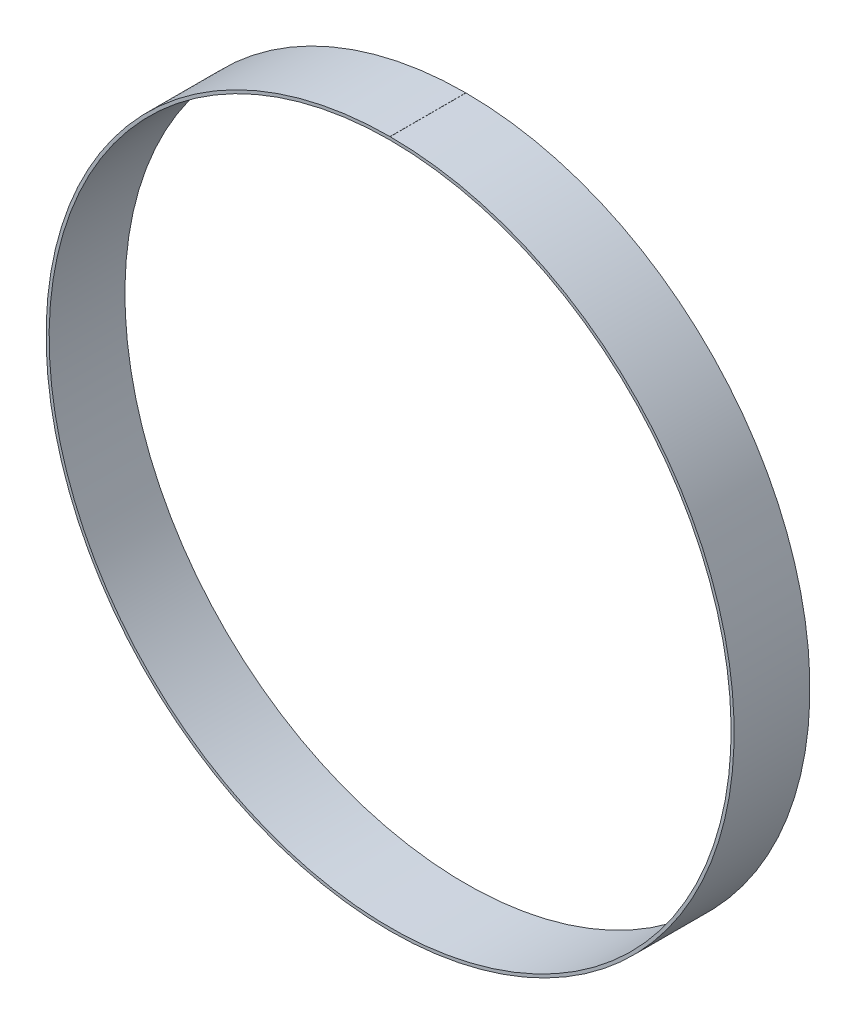
ISO-10303-21;
HEADER;
FILE_DESCRIPTION(('STEP AP214'),'2;1');
FILE_NAME('part.step','',(''),(''),'','','');
FILE_SCHEMA(('AUTOMOTIVE_DESIGN { 1 0 10303 214 1 1 1 1 }'));
ENDSEC;
DATA;
#1=APPLICATION_CONTEXT('core data for automotive mechanical design processes');
#2=APPLICATION_PROTOCOL_DEFINITION('international standard','automotive_design',2000,#1);
#3=PRODUCT_CONTEXT('',#1,'mechanical');
#4=PRODUCT('Part','Part','',(#3));
#5=PRODUCT_RELATED_PRODUCT_CATEGORY('part','',(#4));
#6=PRODUCT_DEFINITION_FORMATION('','',#4);
#7=PRODUCT_DEFINITION_CONTEXT('part definition',#1,'design');
#8=PRODUCT_DEFINITION('design','',#6,#7);
#9=PRODUCT_DEFINITION_SHAPE('','',#8);
#10=(LENGTH_UNIT() NAMED_UNIT(*) SI_UNIT(.MILLI.,.METRE.));
#11=(NAMED_UNIT(*) PLANE_ANGLE_UNIT() SI_UNIT($,.RADIAN.));
#12=(NAMED_UNIT(*) SI_UNIT($,.STERADIAN.) SOLID_ANGLE_UNIT());
#13=UNCERTAINTY_MEASURE_WITH_UNIT(LENGTH_MEASURE(1.E-05),#10,'distance_accuracy_value','');
#14=(GEOMETRIC_REPRESENTATION_CONTEXT(3) GLOBAL_UNCERTAINTY_ASSIGNED_CONTEXT((#13)) GLOBAL_UNIT_ASSIGNED_CONTEXT((#10,
#11,#12)) REPRESENTATION_CONTEXT('',''));
#15=CARTESIAN_POINT('',(0.,0.,0.));
#16=DIRECTION('',(0.,0.,1.));
#17=DIRECTION('',(1.,0.,0.));
#18=AXIS2_PLACEMENT_3D('',#15,#16,#17);
#19=CARTESIAN_POINT('',(-0.0499999999893381,227.,1.55431223447522E-12));
#20=DIRECTION('',(0.999999975741816,0.000220264311790574,0.));
#21=DIRECTION('',(0.,0.,-1.));
#22=AXIS2_PLACEMENT_3D('',#19,#20,#21);
#23=PLANE('',#22);
#24=DIRECTION('',(-0.000220264311790574,0.999999975741816,0.));
#25=VECTOR('',#24,1.);
#26=CARTESIAN_POINT('',(-0.0499999999893936,227.,24.9999999999999));
#27=LINE('',#26,#25);
#28=CARTESIAN_POINT('',(-0.0495594713658349,225.000000048516,24.9999999999999));
#29=VERTEX_POINT('',#28);
#30=CARTESIAN_POINT('',(-0.0499999999893936,227.,24.9999999999999));
#31=VERTEX_POINT('',#30);
#32=EDGE_CURVE('E12',#29,#31,#27,.T.);
#33=ORIENTED_EDGE('',*,*,#32,.F.);
#34=DIRECTION('',(0.,0.,1.));
#35=VECTOR('',#34,1.);
#36=CARTESIAN_POINT('',(-0.0495594713626246,225.000000048516,-1420.78267888831));
#37=LINE('',#36,#35);
#38=CARTESIAN_POINT('',(-0.0495594713657239,225.000000048516,-24.9999999999968));
#39=VERTEX_POINT('',#38);
#40=EDGE_CURVE('E81',#29,#39,#37,.F.);
#41=ORIENTED_EDGE('',*,*,#40,.T.);
#42=DIRECTION('',(-0.000220264311790574,0.999999975741816,0.));
#43=VECTOR('',#42,1.);
#44=CARTESIAN_POINT('',(-0.0499999999892826,227.,-24.9999999999968));
#45=LINE('',#44,#43);
#46=CARTESIAN_POINT('',(-0.0499999999892826,227.,-24.9999999999968));
#47=VERTEX_POINT('',#46);
#48=EDGE_CURVE('E55',#39,#47,#45,.T.);
#49=ORIENTED_EDGE('',*,*,#48,.T.);
#50=DIRECTION('',(0.,0.,-1.));
#51=VECTOR('',#50,1.);
#52=CARTESIAN_POINT('',(-0.0499999999893936,227.,24.9999999999999));
#53=LINE('',#52,#51);
#54=EDGE_CURVE('E84',#31,#47,#53,.T.);
#55=ORIENTED_EDGE('',*,*,#54,.F.);
#56=EDGE_LOOP('',(#33,#41,#49,#55));
#57=FACE_BOUND('',#56,.T.);
#58=ADVANCED_FACE('F45',(#57),#23,.T.);
#59=CARTESIAN_POINT('',(-1.21282239080259E-09,5.50660761433619E-06,-24.9999999999968));
#60=DIRECTION('',(0.,0.,-1.));
#61=DIRECTION('',(-1.,0.,0.));
#62=AXIS2_PLACEMENT_3D('',#59,#60,#61);
#63=PLANE('',#62);
#64=ORIENTED_EDGE('',*,*,#48,.F.);
#65=CARTESIAN_POINT('',(-1.21282239126486E-09,5.50660761433619E-06,-24.9999999999968));
#66=DIRECTION('',(0.,0.,1.));
#67=DIRECTION('',(1.,0.,0.));
#68=AXIS2_PLACEMENT_3D('',#65,#66,#67);
#69=CIRCLE('',#68,225.);
#70=CARTESIAN_POINT('',(0.0495594689548948,225.000000048516,-24.9999999999968));
#71=VERTEX_POINT('',#70);
#72=EDGE_CURVE('E96',#39,#71,#69,.T.);
#73=ORIENTED_EDGE('',*,*,#72,.T.);
#74=DIRECTION('',(0.000220264311855411,0.999999975741816,0.));
#75=VECTOR('',#74,1.);
#76=CARTESIAN_POINT('',(0.0499999975783558,227.,-24.9999999999968));
#77=LINE('',#76,#75);
#78=CARTESIAN_POINT('',(0.0499999975783558,227.,-24.9999999999968));
#79=VERTEX_POINT('',#78);
#80=EDGE_CURVE('E105',#71,#79,#77,.T.);
#81=ORIENTED_EDGE('',*,*,#80,.T.);
#82=CARTESIAN_POINT('',(-1.21282239080259E-09,5.50660761433619E-06,-24.9999999999968));
#83=DIRECTION('',(0.,0.,1.));
#84=DIRECTION('',(1.,0.,0.));
#85=AXIS2_PLACEMENT_3D('',#82,#83,#84);
#86=CIRCLE('',#85,227.);
#87=EDGE_CURVE('E100',#47,#79,#86,.T.);
#88=ORIENTED_EDGE('',*,*,#87,.F.);
#89=EDGE_LOOP('',(#64,#73,#81,#88));
#90=FACE_BOUND('',#89,.T.);
#91=ADVANCED_FACE('F113',(#90),#63,.T.);
#92=CARTESIAN_POINT('',(0.0499999975785297,227.,1.55431223447522E-12));
#93=DIRECTION('',(-0.999999975741816,0.000220264311856421,0.));
#94=DIRECTION('',(0.,0.,1.));
#95=AXIS2_PLACEMENT_3D('',#92,#93,#94);
#96=PLANE('',#95);
#97=ORIENTED_EDGE('',*,*,#80,.F.);
#98=DIRECTION('',(0.,0.,1.));
#99=VECTOR('',#98,1.);
#100=CARTESIAN_POINT('',(0.0495594689579941,225.000000048516,-1420.78267888831));
#101=LINE('',#100,#99);
#102=CARTESIAN_POINT('',(0.0495594689547838,225.000000048516,24.9999999999999));
#103=VERTEX_POINT('',#102);
#104=EDGE_CURVE('E98',#71,#103,#101,.T.);
#105=ORIENTED_EDGE('',*,*,#104,.T.);
#106=DIRECTION('',(0.000220264311857309,0.999999975741816,0.));
#107=VECTOR('',#106,1.);
#108=CARTESIAN_POINT('',(0.0499999975786758,227.,24.9999999999999));
#109=LINE('',#108,#107);
#110=CARTESIAN_POINT('',(0.0499999975786758,227.,24.9999999999999));
#111=VERTEX_POINT('',#110);
#112=EDGE_CURVE('E49',#103,#111,#109,.T.);
#113=ORIENTED_EDGE('',*,*,#112,.T.);
#114=DIRECTION('',(0.,0.,1.));
#115=VECTOR('',#114,1.);
#116=CARTESIAN_POINT('',(0.0499999975783836,227.,-24.9999999999968));
#117=LINE('',#116,#115);
#118=EDGE_CURVE('E114',#79,#111,#117,.T.);
#119=ORIENTED_EDGE('',*,*,#118,.F.);
#120=EDGE_LOOP('',(#97,#105,#113,#119));
#121=FACE_BOUND('',#120,.T.);
#122=ADVANCED_FACE('F118',(#121),#96,.T.);
#123=CARTESIAN_POINT('',(-1.21293341310506E-09,5.50660761433619E-06,24.9999999999999));
#124=DIRECTION('',(0.,0.,1.));
#125=DIRECTION('',(1.,0.,0.));
#126=AXIS2_PLACEMENT_3D('',#123,#124,#125);
#127=PLANE('',#126);
#128=CARTESIAN_POINT('',(-1.21293341356732E-09,5.50660761433619E-06,24.9999999999999));
#129=DIRECTION('',(0.,0.,1.));
#130=DIRECTION('',(1.,0.,0.));
#131=AXIS2_PLACEMENT_3D('',#128,#129,#130);
#132=CIRCLE('',#131,225.);
#133=EDGE_CURVE('E94',#103,#29,#132,.F.);
#134=ORIENTED_EDGE('',*,*,#133,.T.);
#135=ORIENTED_EDGE('',*,*,#32,.T.);
#136=CARTESIAN_POINT('',(-1.21293341310506E-09,5.50660761433619E-06,24.9999999999999));
#137=DIRECTION('',(0.,0.,-1.));
#138=DIRECTION('',(-1.,0.,0.));
#139=AXIS2_PLACEMENT_3D('',#136,#137,#138);
#140=CIRCLE('',#139,227.);
#141=EDGE_CURVE('E112',#111,#31,#140,.T.);
#142=ORIENTED_EDGE('',*,*,#141,.F.);
#143=ORIENTED_EDGE('',*,*,#112,.F.);
#144=EDGE_LOOP('',(#134,#135,#142,#143));
#145=FACE_BOUND('',#144,.T.);
#146=ADVANCED_FACE('F47',(#145),#127,.T.);
#147=CARTESIAN_POINT('',(-1.20972313112991E-09,5.50660761433619E-06,-1420.78267888831));
#148=DIRECTION('',(0.,0.,1.));
#149=DIRECTION('',(1.,0.,0.));
#150=AXIS2_PLACEMENT_3D('',#147,#148,#149);
#151=CYLINDRICAL_SURFACE('',#150,227.);
#152=ORIENTED_EDGE('',*,*,#118,.T.);
#153=ORIENTED_EDGE('',*,*,#141,.T.);
#154=ORIENTED_EDGE('',*,*,#54,.T.);
#155=ORIENTED_EDGE('',*,*,#87,.T.);
#156=EDGE_LOOP('',(#152,#153,#154,#155));
#157=FACE_BOUND('',#156,.T.);
#158=ADVANCED_FACE('F111',(#157),#151,.T.);
#159=CARTESIAN_POINT('',(-1.20972313112991E-09,5.50660761433619E-06,-1420.78267888831));
#160=DIRECTION('',(0.,0.,1.));
#161=DIRECTION('',(1.,0.,0.));
#162=AXIS2_PLACEMENT_3D('',#159,#160,#161);
#163=CYLINDRICAL_SURFACE('',#162,225.);
#164=ORIENTED_EDGE('',*,*,#104,.F.);
#165=ORIENTED_EDGE('',*,*,#72,.F.);
#166=ORIENTED_EDGE('',*,*,#40,.F.);
#167=ORIENTED_EDGE('',*,*,#133,.F.);
#168=EDGE_LOOP('',(#164,#165,#166,#167));
#169=FACE_BOUND('',#168,.T.);
#170=ADVANCED_FACE('F93',(#169),#163,.F.);
#171=CLOSED_SHELL('',(#58,#91,#122,#146,#158,#170));
#172=MANIFOLD_SOLID_BREP('B2',#171);
#173=ADVANCED_BREP_SHAPE_REPRESENTATION('',(#18,#172),#14);
#174=SHAPE_DEFINITION_REPRESENTATION(#9,#173);
ENDSEC;
END-ISO-10303-21;
